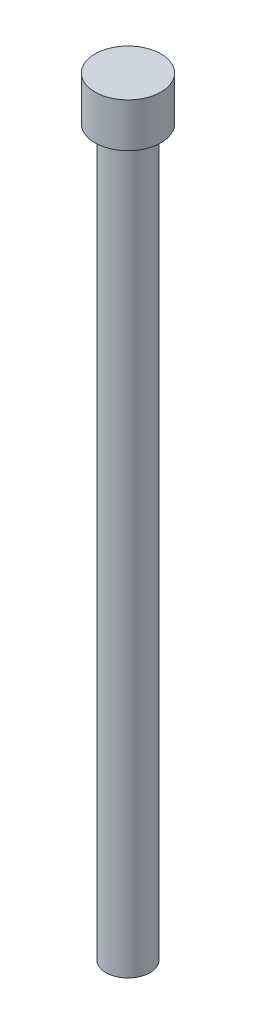
ISO-10303-21;
HEADER;
FILE_DESCRIPTION(('STEP AP214'),'2;1');
FILE_NAME('part.step','',(''),(''),'','','');
FILE_SCHEMA(('AUTOMOTIVE_DESIGN { 1 0 10303 214 1 1 1 1 }'));
ENDSEC;
DATA;
#1=APPLICATION_CONTEXT('core data for automotive mechanical design processes');
#2=APPLICATION_PROTOCOL_DEFINITION('international standard','automotive_design',2000,#1);
#3=PRODUCT_CONTEXT('',#1,'mechanical');
#4=PRODUCT('Part','Part','',(#3));
#5=PRODUCT_RELATED_PRODUCT_CATEGORY('part','',(#4));
#6=PRODUCT_DEFINITION_FORMATION('','',#4);
#7=PRODUCT_DEFINITION_CONTEXT('part definition',#1,'design');
#8=PRODUCT_DEFINITION('design','',#6,#7);
#9=PRODUCT_DEFINITION_SHAPE('','',#8);
#10=(LENGTH_UNIT() NAMED_UNIT(*) SI_UNIT(.MILLI.,.METRE.));
#11=(NAMED_UNIT(*) PLANE_ANGLE_UNIT() SI_UNIT($,.RADIAN.));
#12=(NAMED_UNIT(*) SI_UNIT($,.STERADIAN.) SOLID_ANGLE_UNIT());
#13=UNCERTAINTY_MEASURE_WITH_UNIT(LENGTH_MEASURE(1.E-05),#10,'distance_accuracy_value','');
#14=(GEOMETRIC_REPRESENTATION_CONTEXT(3) GLOBAL_UNCERTAINTY_ASSIGNED_CONTEXT((#13)) GLOBAL_UNIT_ASSIGNED_CONTEXT((#10,
#11,#12)) REPRESENTATION_CONTEXT('',''));
#15=CARTESIAN_POINT('',(0.,0.,0.));
#16=DIRECTION('',(0.,0.,1.));
#17=DIRECTION('',(1.,0.,0.));
#18=AXIS2_PLACEMENT_3D('',#15,#16,#17);
#19=CARTESIAN_POINT('',(0.,65.8,0.));
#20=DIRECTION('',(0.,-1.,0.));
#21=DIRECTION('',(0.,0.,-1.));
#22=AXIS2_PLACEMENT_3D('',#19,#20,#21);
#23=CYLINDRICAL_SURFACE('',#22,2.);
#24=CARTESIAN_POINT('',(0.,65.8,0.));
#25=DIRECTION('',(0.,1.,0.));
#26=DIRECTION('',(0.,0.,1.));
#27=AXIS2_PLACEMENT_3D('',#24,#25,#26);
#28=CIRCLE('',#27,2.);
#29=CARTESIAN_POINT('',(0.,65.8,2.));
#30=VERTEX_POINT('',#29);
#31=EDGE_CURVE('E10',#30,#30,#28,.T.);
#32=ORIENTED_EDGE('',*,*,#31,.F.);
#33=EDGE_LOOP('',(#32));
#34=FACE_BOUND('',#33,.T.);
#35=CARTESIAN_POINT('',(0.,0.,0.));
#36=DIRECTION('',(0.,1.,0.));
#37=DIRECTION('',(0.,0.,1.));
#38=AXIS2_PLACEMENT_3D('',#35,#36,#37);
#39=CIRCLE('',#38,2.);
#40=CARTESIAN_POINT('',(0.,0.,2.));
#41=VERTEX_POINT('',#40);
#42=EDGE_CURVE('E40',#41,#41,#39,.T.);
#43=ORIENTED_EDGE('',*,*,#42,.T.);
#44=EDGE_LOOP('',(#43));
#45=FACE_BOUND('',#44,.T.);
#46=ADVANCED_FACE('F37',(#34,#45),#23,.T.);
#47=CARTESIAN_POINT('',(0.,0.,0.));
#48=DIRECTION('',(0.,1.,0.));
#49=DIRECTION('',(0.,0.,1.));
#50=AXIS2_PLACEMENT_3D('',#47,#48,#49);
#51=PLANE('',#50);
#52=ORIENTED_EDGE('',*,*,#42,.F.);
#53=EDGE_LOOP('',(#52));
#54=FACE_BOUND('',#53,.T.);
#55=ADVANCED_FACE('F60',(#54),#51,.F.);
#56=CARTESIAN_POINT('',(0.,69.8,0.));
#57=DIRECTION('',(0.,-1.,0.));
#58=DIRECTION('',(0.,0.,-1.));
#59=AXIS2_PLACEMENT_3D('',#56,#57,#58);
#60=CYLINDRICAL_SURFACE('',#59,3.);
#61=CARTESIAN_POINT('',(0.,69.8,0.));
#62=DIRECTION('',(0.,1.,0.));
#63=DIRECTION('',(0.,0.,1.));
#64=AXIS2_PLACEMENT_3D('',#61,#62,#63);
#65=CIRCLE('',#64,3.);
#66=CARTESIAN_POINT('',(0.,69.8,3.));
#67=VERTEX_POINT('',#66);
#68=EDGE_CURVE('E47',#67,#67,#65,.T.);
#69=ORIENTED_EDGE('',*,*,#68,.F.);
#70=EDGE_LOOP('',(#69));
#71=FACE_BOUND('',#70,.T.);
#72=CARTESIAN_POINT('',(0.,65.8,0.));
#73=DIRECTION('',(0.,1.,0.));
#74=DIRECTION('',(0.,0.,1.));
#75=AXIS2_PLACEMENT_3D('',#72,#73,#74);
#76=CIRCLE('',#75,3.);
#77=CARTESIAN_POINT('',(0.,65.8,3.));
#78=VERTEX_POINT('',#77);
#79=EDGE_CURVE('E49',#78,#78,#76,.T.);
#80=ORIENTED_EDGE('',*,*,#79,.T.);
#81=EDGE_LOOP('',(#80));
#82=FACE_BOUND('',#81,.T.);
#83=ADVANCED_FACE('F57',(#71,#82),#60,.T.);
#84=CARTESIAN_POINT('',(0.,69.8,0.));
#85=DIRECTION('',(0.,1.,0.));
#86=DIRECTION('',(0.,0.,1.));
#87=AXIS2_PLACEMENT_3D('',#84,#85,#86);
#88=PLANE('',#87);
#89=ORIENTED_EDGE('',*,*,#68,.T.);
#90=EDGE_LOOP('',(#89));
#91=FACE_BOUND('',#90,.T.);
#92=ADVANCED_FACE('F55',(#91),#88,.T.);
#93=CARTESIAN_POINT('',(0.,65.8,0.));
#94=DIRECTION('',(0.,1.,0.));
#95=DIRECTION('',(0.,0.,1.));
#96=AXIS2_PLACEMENT_3D('',#93,#94,#95);
#97=PLANE('',#96);
#98=ORIENTED_EDGE('',*,*,#31,.T.);
#99=EDGE_LOOP('',(#98));
#100=FACE_BOUND('',#99,.T.);
#101=ORIENTED_EDGE('',*,*,#79,.F.);
#102=EDGE_LOOP('',(#101));
#103=FACE_BOUND('',#102,.T.);
#104=ADVANCED_FACE('F64',(#100,#103),#97,.F.);
#105=CLOSED_SHELL('',(#46,#55,#83,#92,#104));
#106=MANIFOLD_SOLID_BREP('B2',#105);
#107=ADVANCED_BREP_SHAPE_REPRESENTATION('',(#18,#106),#14);
#108=SHAPE_DEFINITION_REPRESENTATION(#9,#107);
ENDSEC;
END-ISO-10303-21;
